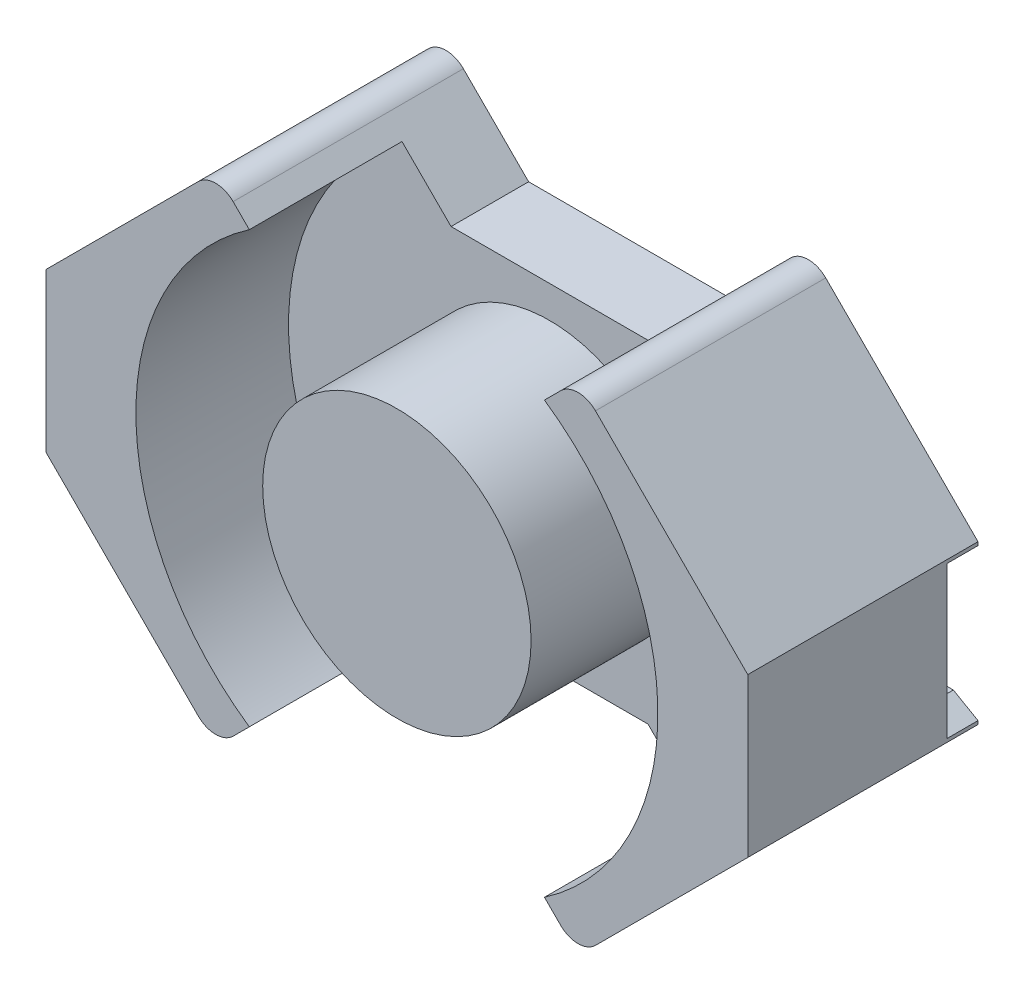
ISO-10303-21;
HEADER;
FILE_DESCRIPTION(('STEP AP214'),'2;1');
FILE_NAME('part.step','',(''),(''),'','','');
FILE_SCHEMA(('AUTOMOTIVE_DESIGN { 1 0 10303 214 1 1 1 1 }'));
ENDSEC;
DATA;
#1=APPLICATION_CONTEXT('core data for automotive mechanical design processes');
#2=APPLICATION_PROTOCOL_DEFINITION('international standard','automotive_design',2000,#1);
#3=PRODUCT_CONTEXT('',#1,'mechanical');
#4=PRODUCT('Part','Part','',(#3));
#5=PRODUCT_RELATED_PRODUCT_CATEGORY('part','',(#4));
#6=PRODUCT_DEFINITION_FORMATION('','',#4);
#7=PRODUCT_DEFINITION_CONTEXT('part definition',#1,'design');
#8=PRODUCT_DEFINITION('design','',#6,#7);
#9=PRODUCT_DEFINITION_SHAPE('','',#8);
#10=(LENGTH_UNIT() NAMED_UNIT(*) SI_UNIT(.MILLI.,.METRE.));
#11=(NAMED_UNIT(*) PLANE_ANGLE_UNIT() SI_UNIT($,.RADIAN.));
#12=(NAMED_UNIT(*) SI_UNIT($,.STERADIAN.) SOLID_ANGLE_UNIT());
#13=UNCERTAINTY_MEASURE_WITH_UNIT(LENGTH_MEASURE(1.E-05),#10,'distance_accuracy_value','');
#14=(GEOMETRIC_REPRESENTATION_CONTEXT(3) GLOBAL_UNCERTAINTY_ASSIGNED_CONTEXT((#13)) GLOBAL_UNIT_ASSIGNED_CONTEXT((#10,
#11,#12)) REPRESENTATION_CONTEXT('',''));
#15=CARTESIAN_POINT('',(0.,0.,0.));
#16=DIRECTION('',(0.,0.,1.));
#17=DIRECTION('',(1.,0.,0.));
#18=AXIS2_PLACEMENT_3D('',#15,#16,#17);
#19=CARTESIAN_POINT('',(0.,0.,9.35));
#20=DIRECTION('',(0.,0.,-1.));
#21=DIRECTION('',(-1.,0.,0.));
#22=AXIS2_PLACEMENT_3D('',#19,#20,#21);
#23=PLANE('',#22);
#24=CARTESIAN_POINT('',(0.,0.,9.35));
#25=DIRECTION('',(0.,0.,-1.));
#26=DIRECTION('',(-1.,0.,0.));
#27=AXIS2_PLACEMENT_3D('',#24,#25,#26);
#28=CIRCLE('',#27,5.45);
#29=CARTESIAN_POINT('',(-5.45,0.,9.35));
#30=VERTEX_POINT('',#29);
#31=EDGE_CURVE('E20',#30,#30,#28,.T.);
#32=ORIENTED_EDGE('',*,*,#31,.F.);
#33=EDGE_LOOP('',(#32));
#34=FACE_BOUND('',#33,.T.);
#35=ADVANCED_FACE('F17',(#34),#23,.F.);
#36=CARTESIAN_POINT('',(0.,0.,9.35));
#37=DIRECTION('',(0.,0.,-1.));
#38=DIRECTION('',(-1.,0.,0.));
#39=AXIS2_PLACEMENT_3D('',#36,#37,#38);
#40=CYLINDRICAL_SURFACE('',#39,5.45);
#41=CARTESIAN_POINT('',(0.,0.,3.15));
#42=DIRECTION('',(0.,0.,-1.));
#43=DIRECTION('',(-1.,0.,0.));
#44=AXIS2_PLACEMENT_3D('',#41,#42,#43);
#45=CIRCLE('',#44,5.45);
#46=CARTESIAN_POINT('',(-5.45,0.,3.15));
#47=VERTEX_POINT('',#46);
#48=EDGE_CURVE('E532',#47,#47,#45,.T.);
#49=ORIENTED_EDGE('',*,*,#48,.F.);
#50=EDGE_LOOP('',(#49));
#51=FACE_BOUND('',#50,.T.);
#52=ORIENTED_EDGE('',*,*,#31,.T.);
#53=EDGE_LOOP('',(#52));
#54=FACE_BOUND('',#53,.T.);
#55=ADVANCED_FACE('F766',(#51,#54),#40,.T.);
#56=CARTESIAN_POINT('',(-7.35776874765386,-8.69355518528076,3.15));
#57=DIRECTION('',(0.,0.,-1.));
#58=DIRECTION('',(-1.,0.,0.));
#59=AXIS2_PLACEMENT_3D('',#56,#57,#58);
#60=CYLINDRICAL_SURFACE('',#59,1.);
#61=CARTESIAN_POINT('',(-7.35776874765386,-8.69355518528076,0.));
#62=DIRECTION('',(0.,0.,-1.));
#63=DIRECTION('',(-1.,0.,0.));
#64=AXIS2_PLACEMENT_3D('',#61,#62,#63);
#65=CIRCLE('',#64,1.);
#66=CARTESIAN_POINT('',(-8.06487552884041,-9.40066196646731,0.));
#67=VERTEX_POINT('',#66);
#68=CARTESIAN_POINT('',(-6.65066196646731,-9.40066196646731,0.));
#69=VERTEX_POINT('',#68);
#70=EDGE_CURVE('E223',#67,#69,#65,.F.);
#71=ORIENTED_EDGE('',*,*,#70,.T.);
#72=DIRECTION('',(0.,0.,1.));
#73=VECTOR('',#72,1.);
#74=CARTESIAN_POINT('',(-6.65066196646731,-9.40066196646731,3.15));
#75=LINE('',#74,#73);
#76=CARTESIAN_POINT('',(-6.65066196646731,-9.40066196646731,9.35));
#77=VERTEX_POINT('',#76);
#78=EDGE_CURVE('E229',#69,#77,#75,.T.);
#79=ORIENTED_EDGE('',*,*,#78,.T.);
#80=CARTESIAN_POINT('',(-7.35776874765386,-8.69355518528076,9.35));
#81=DIRECTION('',(0.,0.,-1.));
#82=DIRECTION('',(-1.,0.,0.));
#83=AXIS2_PLACEMENT_3D('',#80,#81,#82);
#84=CIRCLE('',#83,1.);
#85=CARTESIAN_POINT('',(-8.06487552884041,-9.40066196646731,9.35));
#86=VERTEX_POINT('',#85);
#87=EDGE_CURVE('E526',#86,#77,#84,.F.);
#88=ORIENTED_EDGE('',*,*,#87,.F.);
#89=DIRECTION('',(0.,0.,1.));
#90=VECTOR('',#89,1.);
#91=CARTESIAN_POINT('',(-8.06487552884041,-9.40066196646731,3.15));
#92=LINE('',#91,#90);
#93=EDGE_CURVE('E231',#86,#67,#92,.F.);
#94=ORIENTED_EDGE('',*,*,#93,.T.);
#95=EDGE_LOOP('',(#71,#79,#88,#94));
#96=FACE_BOUND('',#95,.T.);
#97=ADVANCED_FACE('F228',(#96),#60,.T.);
#98=CARTESIAN_POINT('',(7.35776874765386,-8.69355518528077,3.15));
#99=DIRECTION('',(0.,0.,-1.));
#100=DIRECTION('',(-1.,0.,0.));
#101=AXIS2_PLACEMENT_3D('',#98,#99,#100);
#102=CYLINDRICAL_SURFACE('',#101,1.);
#103=CARTESIAN_POINT('',(7.35776874765386,-8.69355518528077,0.));
#104=DIRECTION('',(0.,0.,-1.));
#105=DIRECTION('',(-1.,0.,0.));
#106=AXIS2_PLACEMENT_3D('',#103,#104,#105);
#107=CIRCLE('',#106,1.);
#108=CARTESIAN_POINT('',(6.65066196646731,-9.40066196646731,0.));
#109=VERTEX_POINT('',#108);
#110=CARTESIAN_POINT('',(8.06487552884041,-9.40066196646731,0.));
#111=VERTEX_POINT('',#110);
#112=EDGE_CURVE('E233',#109,#111,#107,.F.);
#113=ORIENTED_EDGE('',*,*,#112,.T.);
#114=DIRECTION('',(0.,0.,1.));
#115=VECTOR('',#114,1.);
#116=CARTESIAN_POINT('',(8.06487552884041,-9.40066196646731,3.15));
#117=LINE('',#116,#115);
#118=CARTESIAN_POINT('',(8.06487552884041,-9.40066196646731,9.35));
#119=VERTEX_POINT('',#118);
#120=EDGE_CURVE('E351',#111,#119,#117,.T.);
#121=ORIENTED_EDGE('',*,*,#120,.T.);
#122=CARTESIAN_POINT('',(7.35776874765386,-8.69355518528077,9.35));
#123=DIRECTION('',(0.,0.,-1.));
#124=DIRECTION('',(-1.,0.,0.));
#125=AXIS2_PLACEMENT_3D('',#122,#123,#124);
#126=CIRCLE('',#125,1.);
#127=CARTESIAN_POINT('',(6.65066196646731,-9.40066196646731,9.35));
#128=VERTEX_POINT('',#127);
#129=EDGE_CURVE('E431',#119,#128,#126,.T.);
#130=ORIENTED_EDGE('',*,*,#129,.T.);
#131=DIRECTION('',(0.,0.,1.));
#132=VECTOR('',#131,1.);
#133=CARTESIAN_POINT('',(6.65066196646731,-9.40066196646731,3.15));
#134=LINE('',#133,#132);
#135=EDGE_CURVE('E358',#128,#109,#134,.F.);
#136=ORIENTED_EDGE('',*,*,#135,.T.);
#137=EDGE_LOOP('',(#113,#121,#130,#136));
#138=FACE_BOUND('',#137,.T.);
#139=ADVANCED_FACE('F544',(#138),#102,.T.);
#140=CARTESIAN_POINT('',(0.,0.,1.25));
#141=DIRECTION('',(0.,0.,-1.));
#142=DIRECTION('',(-1.,0.,0.));
#143=AXIS2_PLACEMENT_3D('',#140,#141,#142);
#144=PLANE('',#143);
#145=DIRECTION('',(1.,0.,0.));
#146=VECTOR('',#145,1.);
#147=CARTESIAN_POINT('',(14.25,2.5,1.25));
#148=LINE('',#147,#146);
#149=CARTESIAN_POINT('',(10.6,2.5,1.25));
#150=VERTEX_POINT('',#149);
#151=CARTESIAN_POINT('',(13.25,2.5,1.25));
#152=VERTEX_POINT('',#151);
#153=EDGE_CURVE('E332',#150,#152,#148,.T.);
#154=ORIENTED_EDGE('',*,*,#153,.T.);
#155=DIRECTION('',(0.866025403784439,0.499999999999999,0.));
#156=VECTOR('',#155,1.);
#157=CARTESIAN_POINT('',(13.25,2.5,1.25));
#158=LINE('',#157,#156);
#159=CARTESIAN_POINT('',(14.25,3.07735026918963,1.25));
#160=VERTEX_POINT('',#159);
#161=EDGE_CURVE('E438',#152,#160,#158,.T.);
#162=ORIENTED_EDGE('',*,*,#161,.T.);
#163=DIRECTION('',(0.,1.,0.));
#164=VECTOR('',#163,1.);
#165=CARTESIAN_POINT('',(14.25,-3.21553749530772,1.25));
#166=LINE('',#165,#164);
#167=CARTESIAN_POINT('',(14.25,-3.07735026918963,1.25));
#168=VERTEX_POINT('',#167);
#169=EDGE_CURVE('E434',#160,#168,#166,.F.);
#170=ORIENTED_EDGE('',*,*,#169,.T.);
#171=DIRECTION('',(0.866025403784439,-0.499999999999999,0.));
#172=VECTOR('',#171,1.);
#173=CARTESIAN_POINT('',(13.25,-2.5,1.25));
#174=LINE('',#173,#172);
#175=CARTESIAN_POINT('',(13.25,-2.5,1.25));
#176=VERTEX_POINT('',#175);
#177=EDGE_CURVE('E348',#168,#176,#174,.F.);
#178=ORIENTED_EDGE('',*,*,#177,.T.);
#179=DIRECTION('',(1.,0.,0.));
#180=VECTOR('',#179,1.);
#181=CARTESIAN_POINT('',(14.25,-2.5,1.25));
#182=LINE('',#181,#180);
#183=CARTESIAN_POINT('',(10.6,-2.5,1.25));
#184=VERTEX_POINT('',#183);
#185=EDGE_CURVE('E342',#176,#184,#182,.F.);
#186=ORIENTED_EDGE('',*,*,#185,.T.);
#187=DIRECTION('',(0.,1.,0.));
#188=VECTOR('',#187,1.);
#189=CARTESIAN_POINT('',(10.6,2.5,1.25));
#190=LINE('',#189,#188);
#191=EDGE_CURVE('E340',#150,#184,#190,.F.);
#192=ORIENTED_EDGE('',*,*,#191,.F.);
#193=EDGE_LOOP('',(#154,#162,#170,#178,#186,#192));
#194=FACE_BOUND('',#193,.T.);
#195=ADVANCED_FACE('F671',(#194),#144,.T.);
#196=CARTESIAN_POINT('',(14.25,-3.21553749530772,3.15));
#197=DIRECTION('',(-1.,0.,0.));
#198=DIRECTION('',(0.,0.,1.));
#199=AXIS2_PLACEMENT_3D('',#196,#197,#198);
#200=PLANE('',#199);
#201=DIRECTION('',(0.,0.,1.));
#202=VECTOR('',#201,1.);
#203=CARTESIAN_POINT('',(14.25,-3.07735026918963,1.25));
#204=LINE('',#203,#202);
#205=CARTESIAN_POINT('',(14.25,-3.07735026918963,0.));
#206=VERTEX_POINT('',#205);
#207=EDGE_CURVE('E350',#206,#168,#204,.T.);
#208=ORIENTED_EDGE('',*,*,#207,.T.);
#209=ORIENTED_EDGE('',*,*,#169,.F.);
#210=DIRECTION('',(0.,0.,1.));
#211=VECTOR('',#210,1.);
#212=CARTESIAN_POINT('',(14.25,3.07735026918963,3.15));
#213=LINE('',#212,#211);
#214=CARTESIAN_POINT('',(14.25,3.07735026918962,0.));
#215=VERTEX_POINT('',#214);
#216=EDGE_CURVE('E331',#160,#215,#213,.F.);
#217=ORIENTED_EDGE('',*,*,#216,.T.);
#218=DIRECTION('',(0.,1.,0.));
#219=VECTOR('',#218,1.);
#220=CARTESIAN_POINT('',(14.25,-3.21553749530772,0.));
#221=LINE('',#220,#219);
#222=CARTESIAN_POINT('',(14.25,3.21553749530772,0.));
#223=VERTEX_POINT('',#222);
#224=EDGE_CURVE('E436',#223,#215,#221,.F.);
#225=ORIENTED_EDGE('',*,*,#224,.F.);
#226=DIRECTION('',(0.,0.,1.));
#227=VECTOR('',#226,1.);
#228=CARTESIAN_POINT('',(14.25,3.21553749530772,3.15));
#229=LINE('',#228,#227);
#230=CARTESIAN_POINT('',(14.25,3.21553749530772,9.35000000000001));
#231=VERTEX_POINT('',#230);
#232=EDGE_CURVE('E323',#223,#231,#229,.T.);
#233=ORIENTED_EDGE('',*,*,#232,.T.);
#234=DIRECTION('',(0.,1.,0.));
#235=VECTOR('',#234,1.);
#236=CARTESIAN_POINT('',(14.25,0.,9.35));
#237=LINE('',#236,#235);
#238=CARTESIAN_POINT('',(14.25,-3.21553749530772,9.35000000000001));
#239=VERTEX_POINT('',#238);
#240=EDGE_CURVE('E427',#231,#239,#237,.F.);
#241=ORIENTED_EDGE('',*,*,#240,.T.);
#242=DIRECTION('',(0.,0.,1.));
#243=VECTOR('',#242,1.);
#244=CARTESIAN_POINT('',(14.25,-3.21553749530772,3.15));
#245=LINE('',#244,#243);
#246=CARTESIAN_POINT('',(14.25,-3.21553749530772,0.));
#247=VERTEX_POINT('',#246);
#248=EDGE_CURVE('E355',#239,#247,#245,.F.);
#249=ORIENTED_EDGE('',*,*,#248,.T.);
#250=DIRECTION('',(0.,1.,0.));
#251=VECTOR('',#250,1.);
#252=CARTESIAN_POINT('',(14.25,-3.21553749530772,0.));
#253=LINE('',#252,#251);
#254=EDGE_CURVE('E428',#206,#247,#253,.F.);
#255=ORIENTED_EDGE('',*,*,#254,.F.);
#256=EDGE_LOOP('',(#208,#209,#217,#225,#233,#241,#249,#255));
#257=FACE_BOUND('',#256,.T.);
#258=ADVANCED_FACE('F649',(#257),#200,.F.);
#259=CARTESIAN_POINT('',(0.,0.,9.35));
#260=DIRECTION('',(0.,0.,-1.));
#261=DIRECTION('',(-1.,0.,0.));
#262=AXIS2_PLACEMENT_3D('',#259,#260,#261);
#263=PLANE('',#262);
#264=ORIENTED_EDGE('',*,*,#129,.F.);
#265=DIRECTION('',(-0.707106781186548,-0.707106781186548,0.));
#266=VECTOR('',#265,1.);
#267=CARTESIAN_POINT('',(7.35776874765386,-10.1077687476539,9.35000000000001));
#268=LINE('',#267,#266);
#269=EDGE_CURVE('E354',#119,#239,#268,.F.);
#270=ORIENTED_EDGE('',*,*,#269,.T.);
#271=ORIENTED_EDGE('',*,*,#240,.F.);
#272=DIRECTION('',(0.707106781186548,-0.707106781186548,0.));
#273=VECTOR('',#272,1.);
#274=CARTESIAN_POINT('',(14.25,3.21553749530772,9.35000000000001));
#275=LINE('',#274,#273);
#276=CARTESIAN_POINT('',(8.06487552884041,9.40066196646731,9.35));
#277=VERTEX_POINT('',#276);
#278=EDGE_CURVE('E322',#231,#277,#275,.F.);
#279=ORIENTED_EDGE('',*,*,#278,.T.);
#280=CARTESIAN_POINT('',(7.35776874765386,8.69355518528077,9.35));
#281=DIRECTION('',(0.,0.,-1.));
#282=DIRECTION('',(-1.,0.,0.));
#283=AXIS2_PLACEMENT_3D('',#280,#281,#282);
#284=CIRCLE('',#283,1.);
#285=CARTESIAN_POINT('',(6.65066196646731,9.40066196646732,9.35));
#286=VERTEX_POINT('',#285);
#287=EDGE_CURVE('E537',#286,#277,#284,.T.);
#288=ORIENTED_EDGE('',*,*,#287,.F.);
#289=DIRECTION('',(0.707106781186549,0.707106781186547,0.));
#290=VECTOR('',#289,1.);
#291=CARTESIAN_POINT('',(5.99313239566174,8.74313239566174,9.35));
#292=LINE('',#291,#290);
#293=CARTESIAN_POINT('',(5.99313239566174,8.74313239566174,9.35));
#294=VERTEX_POINT('',#293);
#295=EDGE_CURVE('E425',#294,#286,#292,.T.);
#296=ORIENTED_EDGE('',*,*,#295,.F.);
#297=CARTESIAN_POINT('',(0.,0.,9.35));
#298=DIRECTION('',(0.,0.,-1.));
#299=DIRECTION('',(-1.,0.,0.));
#300=AXIS2_PLACEMENT_3D('',#297,#298,#299);
#301=CIRCLE('',#300,10.6);
#302=CARTESIAN_POINT('',(5.99313239566174,-8.74313239566174,9.35));
#303=VERTEX_POINT('',#302);
#304=EDGE_CURVE('E539',#294,#303,#301,.T.);
#305=ORIENTED_EDGE('',*,*,#304,.T.);
#306=DIRECTION('',(-0.707106781186548,0.707106781186547,0.));
#307=VECTOR('',#306,1.);
#308=CARTESIAN_POINT('',(4.,-6.75,9.35));
#309=LINE('',#308,#307);
#310=EDGE_CURVE('E363',#303,#128,#309,.F.);
#311=ORIENTED_EDGE('',*,*,#310,.T.);
#312=EDGE_LOOP('',(#264,#270,#271,#279,#288,#296,#305,#311));
#313=FACE_BOUND('',#312,.T.);
#314=ADVANCED_FACE('F679',(#313),#263,.F.);
#315=CARTESIAN_POINT('',(0.,0.,9.35));
#316=DIRECTION('',(0.,0.,-1.));
#317=DIRECTION('',(-1.,0.,0.));
#318=AXIS2_PLACEMENT_3D('',#315,#316,#317);
#319=CYLINDRICAL_SURFACE('',#318,10.6);
#320=DIRECTION('',(0.,0.,1.));
#321=VECTOR('',#320,1.);
#322=CARTESIAN_POINT('',(5.99313239566173,-8.74313239566173,3.15));
#323=LINE('',#322,#321);
#324=CARTESIAN_POINT('',(5.99313239566174,-8.74313239566174,3.15));
#325=VERTEX_POINT('',#324);
#326=EDGE_CURVE('E451',#325,#303,#323,.T.);
#327=ORIENTED_EDGE('',*,*,#326,.T.);
#328=ORIENTED_EDGE('',*,*,#304,.F.);
#329=DIRECTION('',(0.,0.,1.));
#330=VECTOR('',#329,1.);
#331=CARTESIAN_POINT('',(5.99313239566174,8.74313239566174,3.15));
#332=LINE('',#331,#330);
#333=CARTESIAN_POINT('',(5.99313239566174,8.74313239566174,3.15));
#334=VERTEX_POINT('',#333);
#335=EDGE_CURVE('E321',#294,#334,#332,.F.);
#336=ORIENTED_EDGE('',*,*,#335,.T.);
#337=CARTESIAN_POINT('',(0.,0.,3.15));
#338=DIRECTION('',(0.,0.,-1.));
#339=DIRECTION('',(-1.,0.,0.));
#340=AXIS2_PLACEMENT_3D('',#337,#338,#339);
#341=CIRCLE('',#340,10.6);
#342=EDGE_CURVE('E530',#325,#334,#341,.F.);
#343=ORIENTED_EDGE('',*,*,#342,.F.);
#344=EDGE_LOOP('',(#327,#328,#336,#343));
#345=FACE_BOUND('',#344,.T.);
#346=ADVANCED_FACE('F749',(#345),#319,.F.);
#347=CARTESIAN_POINT('',(7.35776874765386,8.69355518528077,3.15));
#348=DIRECTION('',(0.,0.,-1.));
#349=DIRECTION('',(-1.,0.,0.));
#350=AXIS2_PLACEMENT_3D('',#347,#348,#349);
#351=CYLINDRICAL_SURFACE('',#350,1.);
#352=CARTESIAN_POINT('',(7.35776874765386,8.69355518528077,0.));
#353=DIRECTION('',(0.,0.,-1.));
#354=DIRECTION('',(-1.,0.,0.));
#355=AXIS2_PLACEMENT_3D('',#352,#353,#354);
#356=CIRCLE('',#355,1.);
#357=CARTESIAN_POINT('',(8.06487552884041,9.40066196646731,0.));
#358=VERTEX_POINT('',#357);
#359=CARTESIAN_POINT('',(6.65066196646732,9.40066196646731,0.));
#360=VERTEX_POINT('',#359);
#361=EDGE_CURVE('E535',#358,#360,#356,.F.);
#362=ORIENTED_EDGE('',*,*,#361,.T.);
#363=DIRECTION('',(0.,0.,1.));
#364=VECTOR('',#363,1.);
#365=CARTESIAN_POINT('',(6.65066196646732,9.40066196646731,3.15));
#366=LINE('',#365,#364);
#367=EDGE_CURVE('E312',#360,#286,#366,.T.);
#368=ORIENTED_EDGE('',*,*,#367,.T.);
#369=ORIENTED_EDGE('',*,*,#287,.T.);
#370=DIRECTION('',(0.,0.,1.));
#371=VECTOR('',#370,1.);
#372=CARTESIAN_POINT('',(8.06487552884041,9.40066196646731,3.15));
#373=LINE('',#372,#371);
#374=EDGE_CURVE('E318',#277,#358,#373,.F.);
#375=ORIENTED_EDGE('',*,*,#374,.T.);
#376=EDGE_LOOP('',(#362,#368,#369,#375));
#377=FACE_BOUND('',#376,.T.);
#378=ADVANCED_FACE('F640',(#377),#351,.T.);
#379=CARTESIAN_POINT('',(7.35776874765387,10.1077687476539,3.15));
#380=DIRECTION('',(0.,0.,1.));
#381=DIRECTION('',(1.,0.,0.));
#382=AXIS2_PLACEMENT_3D('',#379,#380,#381);
#383=PLANE('',#382);
#384=DIRECTION('',(-0.707106781186548,-0.707106781186548,0.));
#385=VECTOR('',#384,1.);
#386=CARTESIAN_POINT('',(-7.35776874765386,-10.1077687476539,3.15));
#387=LINE('',#386,#385);
#388=CARTESIAN_POINT('',(-5.99313239566174,-8.74313239566174,3.15));
#389=VERTEX_POINT('',#388);
#390=CARTESIAN_POINT('',(-4.,-6.75,3.15));
#391=VERTEX_POINT('',#390);
#392=EDGE_CURVE('E243',#389,#391,#387,.F.);
#393=ORIENTED_EDGE('',*,*,#392,.T.);
#394=DIRECTION('',(1.,0.,0.));
#395=VECTOR('',#394,1.);
#396=CARTESIAN_POINT('',(-4.,-6.75,3.15));
#397=LINE('',#396,#395);
#398=CARTESIAN_POINT('',(4.,-6.75,3.15));
#399=VERTEX_POINT('',#398);
#400=EDGE_CURVE('E368',#391,#399,#397,.T.);
#401=ORIENTED_EDGE('',*,*,#400,.T.);
#402=DIRECTION('',(-0.707106781186548,0.707106781186547,0.));
#403=VECTOR('',#402,1.);
#404=CARTESIAN_POINT('',(4.,-6.75,3.15));
#405=LINE('',#404,#403);
#406=EDGE_CURVE('E367',#399,#325,#405,.F.);
#407=ORIENTED_EDGE('',*,*,#406,.T.);
#408=ORIENTED_EDGE('',*,*,#342,.T.);
#409=DIRECTION('',(0.707106781186548,0.707106781186547,0.));
#410=VECTOR('',#409,1.);
#411=CARTESIAN_POINT('',(4.,6.75,3.15));
#412=LINE('',#411,#410);
#413=CARTESIAN_POINT('',(4.,6.75,3.15));
#414=VERTEX_POINT('',#413);
#415=EDGE_CURVE('E317',#334,#414,#412,.F.);
#416=ORIENTED_EDGE('',*,*,#415,.T.);
#417=DIRECTION('',(1.,0.,0.));
#418=VECTOR('',#417,1.);
#419=CARTESIAN_POINT('',(-4.,6.75,3.15));
#420=LINE('',#419,#418);
#421=CARTESIAN_POINT('',(-4.,6.75,3.15));
#422=VERTEX_POINT('',#421);
#423=EDGE_CURVE('E299',#414,#422,#420,.F.);
#424=ORIENTED_EDGE('',*,*,#423,.T.);
#425=DIRECTION('',(0.707106781186548,-0.707106781186548,0.));
#426=VECTOR('',#425,1.);
#427=CARTESIAN_POINT('',(-7.35776874765386,10.1077687476539,3.15));
#428=LINE('',#427,#426);
#429=CARTESIAN_POINT('',(-5.99313239566174,8.74313239566174,3.15));
#430=VERTEX_POINT('',#429);
#431=EDGE_CURVE('E298',#422,#430,#428,.F.);
#432=ORIENTED_EDGE('',*,*,#431,.T.);
#433=CARTESIAN_POINT('',(0.,0.,3.15));
#434=DIRECTION('',(0.,0.,-1.));
#435=DIRECTION('',(-1.,0.,0.));
#436=AXIS2_PLACEMENT_3D('',#433,#434,#435);
#437=CIRCLE('',#436,10.6);
#438=EDGE_CURVE('E491',#430,#389,#437,.F.);
#439=ORIENTED_EDGE('',*,*,#438,.T.);
#440=EDGE_LOOP('',(#393,#401,#407,#408,#416,#424,#432,#439));
#441=FACE_BOUND('',#440,.T.);
#442=ORIENTED_EDGE('',*,*,#48,.T.);
#443=EDGE_LOOP('',(#442));
#444=FACE_BOUND('',#443,.T.);
#445=ADVANCED_FACE('F742',(#441,#444),#383,.T.);
#446=CARTESIAN_POINT('',(0.,0.,9.35));
#447=DIRECTION('',(0.,0.,-1.));
#448=DIRECTION('',(-1.,0.,0.));
#449=AXIS2_PLACEMENT_3D('',#446,#447,#448);
#450=CYLINDRICAL_SURFACE('',#449,10.6);
#451=CARTESIAN_POINT('',(0.,0.,9.35));
#452=DIRECTION('',(0.,0.,-1.));
#453=DIRECTION('',(-1.,0.,0.));
#454=AXIS2_PLACEMENT_3D('',#451,#452,#453);
#455=CIRCLE('',#454,10.6);
#456=CARTESIAN_POINT('',(-5.99313239566174,-8.74313239566174,9.35));
#457=VERTEX_POINT('',#456);
#458=CARTESIAN_POINT('',(-5.99313239566174,8.74313239566174,9.35));
#459=VERTEX_POINT('',#458);
#460=EDGE_CURVE('E524',#457,#459,#455,.T.);
#461=ORIENTED_EDGE('',*,*,#460,.F.);
#462=DIRECTION('',(0.,0.,1.));
#463=VECTOR('',#462,1.);
#464=CARTESIAN_POINT('',(-5.99313239566174,-8.74313239566174,3.15));
#465=LINE('',#464,#463);
#466=EDGE_CURVE('E378',#457,#389,#465,.F.);
#467=ORIENTED_EDGE('',*,*,#466,.T.);
#468=ORIENTED_EDGE('',*,*,#438,.F.);
#469=DIRECTION('',(0.,0.,1.));
#470=VECTOR('',#469,1.);
#471=CARTESIAN_POINT('',(-5.99313239566174,8.74313239566174,3.15));
#472=LINE('',#471,#470);
#473=EDGE_CURVE('E406',#430,#459,#472,.T.);
#474=ORIENTED_EDGE('',*,*,#473,.T.);
#475=EDGE_LOOP('',(#461,#467,#468,#474));
#476=FACE_BOUND('',#475,.T.);
#477=ADVANCED_FACE('F739',(#476),#450,.F.);
#478=CARTESIAN_POINT('',(-14.25,3.21553749530772,3.15));
#479=DIRECTION('',(1.,0.,0.));
#480=DIRECTION('',(0.,1.,0.));
#481=AXIS2_PLACEMENT_3D('',#478,#479,#480);
#482=PLANE('',#481);
#483=DIRECTION('',(0.,1.,0.));
#484=VECTOR('',#483,1.);
#485=CARTESIAN_POINT('',(-14.25,3.21553749530772,0.));
#486=LINE('',#485,#484);
#487=CARTESIAN_POINT('',(-14.25,-3.21553749530772,0.));
#488=VERTEX_POINT('',#487);
#489=CARTESIAN_POINT('',(-14.25,-3.07735026918963,0.));
#490=VERTEX_POINT('',#489);
#491=EDGE_CURVE('E400',#488,#490,#486,.T.);
#492=ORIENTED_EDGE('',*,*,#491,.F.);
#493=DIRECTION('',(0.,0.,1.));
#494=VECTOR('',#493,1.);
#495=CARTESIAN_POINT('',(-14.25,-3.21553749530772,3.15));
#496=LINE('',#495,#494);
#497=CARTESIAN_POINT('',(-14.25,-3.21553749530772,9.35));
#498=VERTEX_POINT('',#497);
#499=EDGE_CURVE('E380',#488,#498,#496,.T.);
#500=ORIENTED_EDGE('',*,*,#499,.T.);
#501=DIRECTION('',(0.,1.,0.));
#502=VECTOR('',#501,1.);
#503=CARTESIAN_POINT('',(-14.25,0.,9.35));
#504=LINE('',#503,#502);
#505=CARTESIAN_POINT('',(-14.25,3.21553749530772,9.35000000000001));
#506=VERTEX_POINT('',#505);
#507=EDGE_CURVE('E393',#506,#498,#504,.F.);
#508=ORIENTED_EDGE('',*,*,#507,.F.);
#509=DIRECTION('',(0.,0.,1.));
#510=VECTOR('',#509,1.);
#511=CARTESIAN_POINT('',(-14.25,3.21553749530772,3.15));
#512=LINE('',#511,#510);
#513=CARTESIAN_POINT('',(-14.25,3.21553749530772,0.));
#514=VERTEX_POINT('',#513);
#515=EDGE_CURVE('E286',#506,#514,#512,.F.);
#516=ORIENTED_EDGE('',*,*,#515,.T.);
#517=DIRECTION('',(0.,1.,0.));
#518=VECTOR('',#517,1.);
#519=CARTESIAN_POINT('',(-14.25,3.21553749530772,0.));
#520=LINE('',#519,#518);
#521=CARTESIAN_POINT('',(-14.25,3.07735026918963,0.));
#522=VERTEX_POINT('',#521);
#523=EDGE_CURVE('E398',#522,#514,#520,.T.);
#524=ORIENTED_EDGE('',*,*,#523,.F.);
#525=DIRECTION('',(0.,0.,1.));
#526=VECTOR('',#525,1.);
#527=CARTESIAN_POINT('',(-14.25,3.07735026918963,3.15));
#528=LINE('',#527,#526);
#529=CARTESIAN_POINT('',(-14.25,3.07735026918963,1.25));
#530=VERTEX_POINT('',#529);
#531=EDGE_CURVE('E401',#530,#522,#528,.F.);
#532=ORIENTED_EDGE('',*,*,#531,.F.);
#533=DIRECTION('',(0.,1.,0.));
#534=VECTOR('',#533,1.);
#535=CARTESIAN_POINT('',(-14.25,0.,1.25));
#536=LINE('',#535,#534);
#537=CARTESIAN_POINT('',(-14.25,-3.07735026918963,1.25));
#538=VERTEX_POINT('',#537);
#539=EDGE_CURVE('E388',#538,#530,#536,.T.);
#540=ORIENTED_EDGE('',*,*,#539,.F.);
#541=DIRECTION('',(0.,0.,1.));
#542=VECTOR('',#541,1.);
#543=CARTESIAN_POINT('',(-14.25,-3.07735026918963,3.15));
#544=LINE('',#543,#542);
#545=EDGE_CURVE('E473',#490,#538,#544,.T.);
#546=ORIENTED_EDGE('',*,*,#545,.F.);
#547=EDGE_LOOP('',(#492,#500,#508,#516,#524,#532,#540,#546));
#548=FACE_BOUND('',#547,.T.);
#549=ADVANCED_FACE('F603',(#548),#482,.F.);
#550=CARTESIAN_POINT('',(-7.35776874765386,8.69355518528076,3.15));
#551=DIRECTION('',(0.,0.,-1.));
#552=DIRECTION('',(-1.,0.,0.));
#553=AXIS2_PLACEMENT_3D('',#550,#551,#552);
#554=CYLINDRICAL_SURFACE('',#553,1.);
#555=CARTESIAN_POINT('',(-7.35776874765386,8.69355518528076,0.));
#556=DIRECTION('',(0.,0.,-1.));
#557=DIRECTION('',(-1.,0.,0.));
#558=AXIS2_PLACEMENT_3D('',#555,#556,#557);
#559=CIRCLE('',#558,1.);
#560=CARTESIAN_POINT('',(-6.65066196646731,9.40066196646731,0.));
#561=VERTEX_POINT('',#560);
#562=CARTESIAN_POINT('',(-8.06487552884041,9.40066196646731,0.));
#563=VERTEX_POINT('',#562);
#564=EDGE_CURVE('E477',#561,#563,#559,.F.);
#565=ORIENTED_EDGE('',*,*,#564,.T.);
#566=DIRECTION('',(0.,0.,1.));
#567=VECTOR('',#566,1.);
#568=CARTESIAN_POINT('',(-8.06487552884041,9.40066196646731,3.15));
#569=LINE('',#568,#567);
#570=CARTESIAN_POINT('',(-8.06487552884041,9.40066196646731,9.35));
#571=VERTEX_POINT('',#570);
#572=EDGE_CURVE('E282',#563,#571,#569,.T.);
#573=ORIENTED_EDGE('',*,*,#572,.T.);
#574=CARTESIAN_POINT('',(-7.35776874765386,8.69355518528076,9.35));
#575=DIRECTION('',(0.,0.,-1.));
#576=DIRECTION('',(-1.,0.,0.));
#577=AXIS2_PLACEMENT_3D('',#574,#575,#576);
#578=CIRCLE('',#577,1.);
#579=CARTESIAN_POINT('',(-6.65066196646731,9.40066196646731,9.35));
#580=VERTEX_POINT('',#579);
#581=EDGE_CURVE('E395',#580,#571,#578,.F.);
#582=ORIENTED_EDGE('',*,*,#581,.F.);
#583=DIRECTION('',(0.,0.,1.));
#584=VECTOR('',#583,1.);
#585=CARTESIAN_POINT('',(-6.65066196646731,9.40066196646731,3.15));
#586=LINE('',#585,#584);
#587=EDGE_CURVE('E289',#580,#561,#586,.F.);
#588=ORIENTED_EDGE('',*,*,#587,.T.);
#589=EDGE_LOOP('',(#565,#573,#582,#588));
#590=FACE_BOUND('',#589,.T.);
#591=ADVANCED_FACE('F623',(#590),#554,.T.);
#592=CARTESIAN_POINT('',(0.,0.,9.35));
#593=DIRECTION('',(0.,0.,1.));
#594=DIRECTION('',(1.,0.,0.));
#595=AXIS2_PLACEMENT_3D('',#592,#593,#594);
#596=PLANE('',#595);
#597=DIRECTION('',(0.707106781186548,0.707106781186548,0.));
#598=VECTOR('',#597,1.);
#599=CARTESIAN_POINT('',(-7.35776874765386,10.1077687476539,9.35000000000001));
#600=LINE('',#599,#598);
#601=EDGE_CURVE('E285',#571,#506,#600,.F.);
#602=ORIENTED_EDGE('',*,*,#601,.T.);
#603=ORIENTED_EDGE('',*,*,#507,.T.);
#604=DIRECTION('',(-0.707106781186547,0.707106781186548,0.));
#605=VECTOR('',#604,1.);
#606=CARTESIAN_POINT('',(-14.25,-3.21553749530772,9.35));
#607=LINE('',#606,#605);
#608=EDGE_CURVE('E379',#498,#86,#607,.F.);
#609=ORIENTED_EDGE('',*,*,#608,.T.);
#610=ORIENTED_EDGE('',*,*,#87,.T.);
#611=DIRECTION('',(-0.707106781186548,-0.707106781186548,0.));
#612=VECTOR('',#611,1.);
#613=CARTESIAN_POINT('',(-7.35776874765386,-10.1077687476539,9.35000000000001));
#614=LINE('',#613,#612);
#615=EDGE_CURVE('E242',#77,#457,#614,.F.);
#616=ORIENTED_EDGE('',*,*,#615,.T.);
#617=ORIENTED_EDGE('',*,*,#460,.T.);
#618=DIRECTION('',(0.707106781186548,-0.707106781186548,0.));
#619=VECTOR('',#618,1.);
#620=CARTESIAN_POINT('',(-7.35776874765386,10.1077687476539,9.35000000000001));
#621=LINE('',#620,#619);
#622=EDGE_CURVE('E294',#459,#580,#621,.F.);
#623=ORIENTED_EDGE('',*,*,#622,.T.);
#624=ORIENTED_EDGE('',*,*,#581,.T.);
#625=EDGE_LOOP('',(#602,#603,#609,#610,#616,#617,#623,#624));
#626=FACE_BOUND('',#625,.T.);
#627=ADVANCED_FACE('F613',(#626),#596,.T.);
#628=CARTESIAN_POINT('',(0.,0.,1.25));
#629=DIRECTION('',(0.,0.,-1.));
#630=DIRECTION('',(-1.,0.,0.));
#631=AXIS2_PLACEMENT_3D('',#628,#629,#630);
#632=PLANE('',#631);
#633=DIRECTION('',(1.,0.,0.));
#634=VECTOR('',#633,1.);
#635=CARTESIAN_POINT('',(-14.25,-2.5,1.25));
#636=LINE('',#635,#634);
#637=CARTESIAN_POINT('',(-10.6,-2.5,1.25));
#638=VERTEX_POINT('',#637);
#639=CARTESIAN_POINT('',(-13.25,-2.5,1.25));
#640=VERTEX_POINT('',#639);
#641=EDGE_CURVE('E265',#638,#640,#636,.F.);
#642=ORIENTED_EDGE('',*,*,#641,.T.);
#643=DIRECTION('',(-0.866025403784439,-0.499999999999999,0.));
#644=VECTOR('',#643,1.);
#645=CARTESIAN_POINT('',(-13.25,-2.5,1.25));
#646=LINE('',#645,#644);
#647=EDGE_CURVE('E383',#640,#538,#646,.T.);
#648=ORIENTED_EDGE('',*,*,#647,.T.);
#649=ORIENTED_EDGE('',*,*,#539,.T.);
#650=DIRECTION('',(-0.866025403784439,0.499999999999999,0.));
#651=VECTOR('',#650,1.);
#652=CARTESIAN_POINT('',(-14.25,3.07735026918963,1.25));
#653=LINE('',#652,#651);
#654=CARTESIAN_POINT('',(-13.25,2.5,1.25));
#655=VERTEX_POINT('',#654);
#656=EDGE_CURVE('E281',#530,#655,#653,.F.);
#657=ORIENTED_EDGE('',*,*,#656,.T.);
#658=DIRECTION('',(1.,0.,0.));
#659=VECTOR('',#658,1.);
#660=CARTESIAN_POINT('',(-14.25,2.5,1.25));
#661=LINE('',#660,#659);
#662=CARTESIAN_POINT('',(-10.6,2.5,1.25));
#663=VERTEX_POINT('',#662);
#664=EDGE_CURVE('E275',#655,#663,#661,.T.);
#665=ORIENTED_EDGE('',*,*,#664,.T.);
#666=DIRECTION('',(0.,1.,0.));
#667=VECTOR('',#666,1.);
#668=CARTESIAN_POINT('',(-10.6,2.5,1.25));
#669=LINE('',#668,#667);
#670=EDGE_CURVE('E273',#638,#663,#669,.T.);
#671=ORIENTED_EDGE('',*,*,#670,.F.);
#672=EDGE_LOOP('',(#642,#648,#649,#657,#665,#671));
#673=FACE_BOUND('',#672,.T.);
#674=ADVANCED_FACE('F605',(#673),#632,.T.);
#675=CARTESIAN_POINT('',(-14.25,-3.21553749530772,3.15));
#676=DIRECTION('',(0.707106781186548,0.707106781186547,0.));
#677=DIRECTION('',(-0.707106781186547,0.707106781186548,0.));
#678=AXIS2_PLACEMENT_3D('',#675,#676,#677);
#679=PLANE('',#678);
#680=ORIENTED_EDGE('',*,*,#93,.F.);
#681=ORIENTED_EDGE('',*,*,#608,.F.);
#682=ORIENTED_EDGE('',*,*,#499,.F.);
#683=DIRECTION('',(0.707106781186547,-0.707106781186548,0.));
#684=VECTOR('',#683,1.);
#685=CARTESIAN_POINT('',(-14.25,-3.21553749530772,0.));
#686=LINE('',#685,#684);
#687=EDGE_CURVE('E251',#488,#67,#686,.T.);
#688=ORIENTED_EDGE('',*,*,#687,.T.);
#689=EDGE_LOOP('',(#680,#681,#682,#688));
#690=FACE_BOUND('',#689,.T.);
#691=ADVANCED_FACE('F611',(#690),#679,.F.);
#692=CARTESIAN_POINT('',(-7.35776874765386,-10.1077687476539,3.15));
#693=DIRECTION('',(-0.707106781186548,0.707106781186548,0.));
#694=DIRECTION('',(-0.707106781186548,-0.707106781186548,0.));
#695=AXIS2_PLACEMENT_3D('',#692,#693,#694);
#696=PLANE('',#695);
#697=ORIENTED_EDGE('',*,*,#78,.F.);
#698=DIRECTION('',(0.707106781186547,0.707106781186548,0.));
#699=VECTOR('',#698,1.);
#700=CARTESIAN_POINT('',(-6.65066196646731,-9.40066196646731,0.));
#701=LINE('',#700,#699);
#702=CARTESIAN_POINT('',(-4.,-6.75,0.));
#703=VERTEX_POINT('',#702);
#704=EDGE_CURVE('E239',#69,#703,#701,.T.);
#705=ORIENTED_EDGE('',*,*,#704,.T.);
#706=DIRECTION('',(0.,0.,1.));
#707=VECTOR('',#706,1.);
#708=CARTESIAN_POINT('',(-4.,-6.75,3.15));
#709=LINE('',#708,#707);
#710=EDGE_CURVE('E373',#703,#391,#709,.T.);
#711=ORIENTED_EDGE('',*,*,#710,.T.);
#712=ORIENTED_EDGE('',*,*,#392,.F.);
#713=ORIENTED_EDGE('',*,*,#466,.F.);
#714=ORIENTED_EDGE('',*,*,#615,.F.);
#715=EDGE_LOOP('',(#697,#705,#711,#712,#713,#714));
#716=FACE_BOUND('',#715,.T.);
#717=ADVANCED_FACE('F237',(#716),#696,.F.);
#718=CARTESIAN_POINT('',(-4.,-6.75,3.15));
#719=DIRECTION('',(0.,1.,0.));
#720=DIRECTION('',(0.,0.,1.));
#721=AXIS2_PLACEMENT_3D('',#718,#719,#720);
#722=PLANE('',#721);
#723=DIRECTION('',(0.,0.,1.));
#724=VECTOR('',#723,1.);
#725=CARTESIAN_POINT('',(4.,-6.75,3.15));
#726=LINE('',#725,#724);
#727=CARTESIAN_POINT('',(4.,-6.75,0.));
#728=VERTEX_POINT('',#727);
#729=EDGE_CURVE('E364',#728,#399,#726,.T.);
#730=ORIENTED_EDGE('',*,*,#729,.T.);
#731=ORIENTED_EDGE('',*,*,#400,.F.);
#732=ORIENTED_EDGE('',*,*,#710,.F.);
#733=DIRECTION('',(1.,0.,0.));
#734=VECTOR('',#733,1.);
#735=CARTESIAN_POINT('',(7.35776874765387,-6.75,0.));
#736=LINE('',#735,#734);
#737=EDGE_CURVE('E250',#703,#728,#736,.T.);
#738=ORIENTED_EDGE('',*,*,#737,.T.);
#739=EDGE_LOOP('',(#730,#731,#732,#738));
#740=FACE_BOUND('',#739,.T.);
#741=ADVANCED_FACE('F722',(#740),#722,.F.);
#742=CARTESIAN_POINT('',(4.,-6.75,3.15));
#743=DIRECTION('',(0.707106781186547,0.707106781186548,0.));
#744=DIRECTION('',(-0.707106781186548,0.707106781186547,0.));
#745=AXIS2_PLACEMENT_3D('',#742,#743,#744);
#746=PLANE('',#745);
#747=ORIENTED_EDGE('',*,*,#135,.F.);
#748=ORIENTED_EDGE('',*,*,#310,.F.);
#749=ORIENTED_EDGE('',*,*,#326,.F.);
#750=ORIENTED_EDGE('',*,*,#406,.F.);
#751=ORIENTED_EDGE('',*,*,#729,.F.);
#752=DIRECTION('',(0.707106781186548,-0.707106781186548,0.));
#753=VECTOR('',#752,1.);
#754=CARTESIAN_POINT('',(4.,-6.75,0.));
#755=LINE('',#754,#753);
#756=EDGE_CURVE('E253',#728,#109,#755,.T.);
#757=ORIENTED_EDGE('',*,*,#756,.T.);
#758=EDGE_LOOP('',(#747,#748,#749,#750,#751,#757));
#759=FACE_BOUND('',#758,.T.);
#760=ADVANCED_FACE('F719',(#759),#746,.F.);
#761=CARTESIAN_POINT('',(7.35776874765386,-10.1077687476539,3.15));
#762=DIRECTION('',(-0.707106781186548,0.707106781186548,0.));
#763=DIRECTION('',(-0.707106781186548,-0.707106781186548,0.));
#764=AXIS2_PLACEMENT_3D('',#761,#762,#763);
#765=PLANE('',#764);
#766=ORIENTED_EDGE('',*,*,#120,.F.);
#767=DIRECTION('',(0.707106781186547,0.707106781186548,0.));
#768=VECTOR('',#767,1.);
#769=CARTESIAN_POINT('',(8.06487552884041,-9.40066196646732,0.));
#770=LINE('',#769,#768);
#771=EDGE_CURVE('E509',#111,#247,#770,.T.);
#772=ORIENTED_EDGE('',*,*,#771,.T.);
#773=ORIENTED_EDGE('',*,*,#248,.F.);
#774=ORIENTED_EDGE('',*,*,#269,.F.);
#775=EDGE_LOOP('',(#766,#772,#773,#774));
#776=FACE_BOUND('',#775,.T.);
#777=ADVANCED_FACE('F551',(#776),#765,.F.);
#778=CARTESIAN_POINT('',(13.25,-2.5,1.25));
#779=DIRECTION('',(-0.499999999999999,-0.866025403784439,0.));
#780=DIRECTION('',(0.866025403784439,-0.499999999999999,0.));
#781=AXIS2_PLACEMENT_3D('',#778,#779,#780);
#782=PLANE('',#781);
#783=ORIENTED_EDGE('',*,*,#207,.F.);
#784=DIRECTION('',(-0.866025403784439,0.499999999999999,0.));
#785=VECTOR('',#784,1.);
#786=CARTESIAN_POINT('',(14.25,-3.07735026918963,0.));
#787=LINE('',#786,#785);
#788=CARTESIAN_POINT('',(13.25,-2.5,0.));
#789=VERTEX_POINT('',#788);
#790=EDGE_CURVE('E505',#206,#789,#787,.T.);
#791=ORIENTED_EDGE('',*,*,#790,.T.);
#792=DIRECTION('',(0.,0.,-1.));
#793=VECTOR('',#792,1.);
#794=CARTESIAN_POINT('',(13.25,-2.5,1.25));
#795=LINE('',#794,#793);
#796=EDGE_CURVE('E345',#789,#176,#795,.F.);
#797=ORIENTED_EDGE('',*,*,#796,.T.);
#798=ORIENTED_EDGE('',*,*,#177,.F.);
#799=EDGE_LOOP('',(#783,#791,#797,#798));
#800=FACE_BOUND('',#799,.T.);
#801=ADVANCED_FACE('F669',(#800),#782,.F.);
#802=CARTESIAN_POINT('',(14.25,-2.5,1.25));
#803=DIRECTION('',(0.,-1.,0.));
#804=DIRECTION('',(0.,0.,-1.));
#805=AXIS2_PLACEMENT_3D('',#802,#803,#804);
#806=PLANE('',#805);
#807=ORIENTED_EDGE('',*,*,#796,.F.);
#808=DIRECTION('',(1.,0.,0.));
#809=VECTOR('',#808,1.);
#810=CARTESIAN_POINT('',(7.35776874765387,-2.5,0.));
#811=LINE('',#810,#809);
#812=CARTESIAN_POINT('',(10.3795912741144,-2.5,0.));
#813=VERTEX_POINT('',#812);
#814=EDGE_CURVE('E508',#789,#813,#811,.F.);
#815=ORIENTED_EDGE('',*,*,#814,.T.);
#816=DIRECTION('',(-0.173648177666931,0.,-0.984807753012208));
#817=VECTOR('',#816,1.);
#818=CARTESIAN_POINT('',(10.6,-2.5,1.25));
#819=LINE('',#818,#817);
#820=EDGE_CURVE('E338',#184,#813,#819,.T.);
#821=ORIENTED_EDGE('',*,*,#820,.F.);
#822=ORIENTED_EDGE('',*,*,#185,.F.);
#823=EDGE_LOOP('',(#807,#815,#821,#822));
#824=FACE_BOUND('',#823,.T.);
#825=ADVANCED_FACE('F664',(#824),#806,.F.);
#826=CARTESIAN_POINT('',(10.6,2.5,1.25));
#827=DIRECTION('',(0.984807753012208,0.,-0.173648177666931));
#828=DIRECTION('',(-0.173648177666931,0.,-0.984807753012208));
#829=AXIS2_PLACEMENT_3D('',#826,#827,#828);
#830=PLANE('',#829);
#831=ORIENTED_EDGE('',*,*,#191,.T.);
#832=ORIENTED_EDGE('',*,*,#820,.T.);
#833=DIRECTION('',(0.,1.,0.));
#834=VECTOR('',#833,1.);
#835=CARTESIAN_POINT('',(10.3795912741144,10.1077687476539,0.));
#836=LINE('',#835,#834);
#837=CARTESIAN_POINT('',(10.3795912741144,2.5,0.));
#838=VERTEX_POINT('',#837);
#839=EDGE_CURVE('E559',#813,#838,#836,.T.);
#840=ORIENTED_EDGE('',*,*,#839,.T.);
#841=DIRECTION('',(0.17364817766693,0.,0.984807753012208));
#842=VECTOR('',#841,1.);
#843=CARTESIAN_POINT('',(10.3795912741144,2.5,0.));
#844=LINE('',#843,#842);
#845=EDGE_CURVE('E335',#838,#150,#844,.T.);
#846=ORIENTED_EDGE('',*,*,#845,.T.);
#847=EDGE_LOOP('',(#831,#832,#840,#846));
#848=FACE_BOUND('',#847,.T.);
#849=ADVANCED_FACE('F660',(#848),#830,.T.);
#850=CARTESIAN_POINT('',(14.25,2.5,1.25));
#851=DIRECTION('',(0.,1.,0.));
#852=DIRECTION('',(0.,0.,1.));
#853=AXIS2_PLACEMENT_3D('',#850,#851,#852);
#854=PLANE('',#853);
#855=DIRECTION('',(0.,0.,1.));
#856=VECTOR('',#855,1.);
#857=CARTESIAN_POINT('',(13.25,2.5,3.15));
#858=LINE('',#857,#856);
#859=CARTESIAN_POINT('',(13.25,2.5,0.));
#860=VERTEX_POINT('',#859);
#861=EDGE_CURVE('E326',#860,#152,#858,.T.);
#862=ORIENTED_EDGE('',*,*,#861,.T.);
#863=ORIENTED_EDGE('',*,*,#153,.F.);
#864=ORIENTED_EDGE('',*,*,#845,.F.);
#865=DIRECTION('',(1.,0.,0.));
#866=VECTOR('',#865,1.);
#867=CARTESIAN_POINT('',(7.35776874765387,2.5,0.));
#868=LINE('',#867,#866);
#869=EDGE_CURVE('E520',#838,#860,#868,.T.);
#870=ORIENTED_EDGE('',*,*,#869,.T.);
#871=EDGE_LOOP('',(#862,#863,#864,#870));
#872=FACE_BOUND('',#871,.T.);
#873=ADVANCED_FACE('F657',(#872),#854,.F.);
#874=CARTESIAN_POINT('',(14.25,3.07735026918963,3.15));
#875=DIRECTION('',(-0.499999999999999,0.866025403784439,0.));
#876=DIRECTION('',(-0.866025403784439,-0.499999999999999,0.));
#877=AXIS2_PLACEMENT_3D('',#874,#875,#876);
#878=PLANE('',#877);
#879=ORIENTED_EDGE('',*,*,#861,.F.);
#880=DIRECTION('',(0.86602540378444,0.499999999999998,0.));
#881=VECTOR('',#880,1.);
#882=CARTESIAN_POINT('',(13.25,2.5,0.));
#883=LINE('',#882,#881);
#884=EDGE_CURVE('E516',#860,#215,#883,.T.);
#885=ORIENTED_EDGE('',*,*,#884,.T.);
#886=ORIENTED_EDGE('',*,*,#216,.F.);
#887=ORIENTED_EDGE('',*,*,#161,.F.);
#888=EDGE_LOOP('',(#879,#885,#886,#887));
#889=FACE_BOUND('',#888,.T.);
#890=ADVANCED_FACE('F653',(#889),#878,.F.);
#891=CARTESIAN_POINT('',(14.25,3.21553749530772,3.15));
#892=DIRECTION('',(-0.707106781186548,-0.707106781186548,0.));
#893=DIRECTION('',(0.707106781186548,-0.707106781186548,0.));
#894=AXIS2_PLACEMENT_3D('',#891,#892,#893);
#895=PLANE('',#894);
#896=ORIENTED_EDGE('',*,*,#374,.F.);
#897=ORIENTED_EDGE('',*,*,#278,.F.);
#898=ORIENTED_EDGE('',*,*,#232,.F.);
#899=DIRECTION('',(-0.707106781186547,0.707106781186547,0.));
#900=VECTOR('',#899,1.);
#901=CARTESIAN_POINT('',(14.25,3.21553749530772,0.));
#902=LINE('',#901,#900);
#903=EDGE_CURVE('E519',#223,#358,#902,.T.);
#904=ORIENTED_EDGE('',*,*,#903,.T.);
#905=EDGE_LOOP('',(#896,#897,#898,#904));
#906=FACE_BOUND('',#905,.T.);
#907=ADVANCED_FACE('F646',(#906),#895,.F.);
#908=CARTESIAN_POINT('',(4.,6.75,3.15));
#909=DIRECTION('',(0.707106781186547,-0.707106781186548,0.));
#910=DIRECTION('',(0.707106781186548,0.707106781186547,0.));
#911=AXIS2_PLACEMENT_3D('',#908,#909,#910);
#912=PLANE('',#911);
#913=ORIENTED_EDGE('',*,*,#367,.F.);
#914=DIRECTION('',(-0.707106781186548,-0.707106781186547,0.));
#915=VECTOR('',#914,1.);
#916=CARTESIAN_POINT('',(6.65066196646732,9.40066196646731,0.));
#917=LINE('',#916,#915);
#918=CARTESIAN_POINT('',(4.,6.75,0.));
#919=VERTEX_POINT('',#918);
#920=EDGE_CURVE('E306',#360,#919,#917,.T.);
#921=ORIENTED_EDGE('',*,*,#920,.T.);
#922=DIRECTION('',(0.,0.,-1.));
#923=VECTOR('',#922,1.);
#924=CARTESIAN_POINT('',(4.,6.75,3.15));
#925=LINE('',#924,#923);
#926=EDGE_CURVE('E309',#919,#414,#925,.F.);
#927=ORIENTED_EDGE('',*,*,#926,.T.);
#928=ORIENTED_EDGE('',*,*,#415,.F.);
#929=ORIENTED_EDGE('',*,*,#335,.F.);
#930=ORIENTED_EDGE('',*,*,#295,.T.);
#931=EDGE_LOOP('',(#913,#921,#927,#928,#929,#930));
#932=FACE_BOUND('',#931,.T.);
#933=ADVANCED_FACE('F635',(#932),#912,.F.);
#934=CARTESIAN_POINT('',(-4.,6.75,3.15));
#935=DIRECTION('',(0.,-1.,0.));
#936=DIRECTION('',(0.,0.,-1.));
#937=AXIS2_PLACEMENT_3D('',#934,#935,#936);
#938=PLANE('',#937);
#939=DIRECTION('',(0.,0.,1.));
#940=VECTOR('',#939,1.);
#941=CARTESIAN_POINT('',(-4.,6.75,3.15));
#942=LINE('',#941,#940);
#943=CARTESIAN_POINT('',(-4.,6.75,0.));
#944=VERTEX_POINT('',#943);
#945=EDGE_CURVE('E295',#944,#422,#942,.T.);
#946=ORIENTED_EDGE('',*,*,#945,.T.);
#947=ORIENTED_EDGE('',*,*,#423,.F.);
#948=ORIENTED_EDGE('',*,*,#926,.F.);
#949=DIRECTION('',(1.,0.,0.));
#950=VECTOR('',#949,1.);
#951=CARTESIAN_POINT('',(7.35776874765387,6.75,0.));
#952=LINE('',#951,#950);
#953=EDGE_CURVE('E302',#919,#944,#952,.F.);
#954=ORIENTED_EDGE('',*,*,#953,.T.);
#955=EDGE_LOOP('',(#946,#947,#948,#954));
#956=FACE_BOUND('',#955,.T.);
#957=ADVANCED_FACE('F631',(#956),#938,.F.);
#958=CARTESIAN_POINT('',(-7.35776874765386,10.1077687476539,3.15));
#959=DIRECTION('',(-0.707106781186548,-0.707106781186548,0.));
#960=DIRECTION('',(0.707106781186548,-0.707106781186548,0.));
#961=AXIS2_PLACEMENT_3D('',#958,#959,#960);
#962=PLANE('',#961);
#963=ORIENTED_EDGE('',*,*,#587,.F.);
#964=ORIENTED_EDGE('',*,*,#622,.F.);
#965=ORIENTED_EDGE('',*,*,#473,.F.);
#966=ORIENTED_EDGE('',*,*,#431,.F.);
#967=ORIENTED_EDGE('',*,*,#945,.F.);
#968=DIRECTION('',(-0.707106781186547,0.707106781186548,0.));
#969=VECTOR('',#968,1.);
#970=CARTESIAN_POINT('',(-4.,6.75,0.));
#971=LINE('',#970,#969);
#972=EDGE_CURVE('E305',#944,#561,#971,.T.);
#973=ORIENTED_EDGE('',*,*,#972,.T.);
#974=EDGE_LOOP('',(#963,#964,#965,#966,#967,#973));
#975=FACE_BOUND('',#974,.T.);
#976=ADVANCED_FACE('F626',(#975),#962,.F.);
#977=CARTESIAN_POINT('',(-7.35776874765386,10.1077687476539,3.15));
#978=DIRECTION('',(0.707106781186548,-0.707106781186548,0.));
#979=DIRECTION('',(0.707106781186548,0.707106781186548,0.));
#980=AXIS2_PLACEMENT_3D('',#977,#978,#979);
#981=PLANE('',#980);
#982=ORIENTED_EDGE('',*,*,#572,.F.);
#983=DIRECTION('',(-0.707106781186547,-0.707106781186547,0.));
#984=VECTOR('',#983,1.);
#985=CARTESIAN_POINT('',(-8.06487552884041,9.40066196646731,0.));
#986=LINE('',#985,#984);
#987=EDGE_CURVE('E486',#563,#514,#986,.T.);
#988=ORIENTED_EDGE('',*,*,#987,.T.);
#989=ORIENTED_EDGE('',*,*,#515,.F.);
#990=ORIENTED_EDGE('',*,*,#601,.F.);
#991=EDGE_LOOP('',(#982,#988,#989,#990));
#992=FACE_BOUND('',#991,.T.);
#993=ADVANCED_FACE('F618',(#992),#981,.F.);
#994=CARTESIAN_POINT('',(-14.25,3.07735026918963,3.15));
#995=DIRECTION('',(0.499999999999999,0.866025403784439,0.));
#996=DIRECTION('',(-0.866025403784439,0.499999999999999,0.));
#997=AXIS2_PLACEMENT_3D('',#994,#995,#996);
#998=PLANE('',#997);
#999=ORIENTED_EDGE('',*,*,#531,.T.);
#1000=DIRECTION('',(0.86602540378444,-0.499999999999998,0.));
#1001=VECTOR('',#1000,1.);
#1002=CARTESIAN_POINT('',(-14.25,3.07735026918963,0.));
#1003=LINE('',#1002,#1001);
#1004=CARTESIAN_POINT('',(-13.25,2.5,0.));
#1005=VERTEX_POINT('',#1004);
#1006=EDGE_CURVE('E482',#522,#1005,#1003,.T.);
#1007=ORIENTED_EDGE('',*,*,#1006,.T.);
#1008=DIRECTION('',(0.,0.,1.));
#1009=VECTOR('',#1008,1.);
#1010=CARTESIAN_POINT('',(-13.25,2.5,1.25));
#1011=LINE('',#1010,#1009);
#1012=EDGE_CURVE('E278',#1005,#655,#1011,.T.);
#1013=ORIENTED_EDGE('',*,*,#1012,.T.);
#1014=ORIENTED_EDGE('',*,*,#656,.F.);
#1015=EDGE_LOOP('',(#999,#1007,#1013,#1014));
#1016=FACE_BOUND('',#1015,.T.);
#1017=ADVANCED_FACE('F599',(#1016),#998,.F.);
#1018=CARTESIAN_POINT('',(-14.25,2.5,1.25));
#1019=DIRECTION('',(0.,1.,0.));
#1020=DIRECTION('',(0.,0.,1.));
#1021=AXIS2_PLACEMENT_3D('',#1018,#1019,#1020);
#1022=PLANE('',#1021);
#1023=DIRECTION('',(-0.173648177666931,0.,0.984807753012208));
#1024=VECTOR('',#1023,1.);
#1025=CARTESIAN_POINT('',(-10.6,2.5,1.25));
#1026=LINE('',#1025,#1024);
#1027=CARTESIAN_POINT('',(-10.3795912741144,2.5,0.));
#1028=VERTEX_POINT('',#1027);
#1029=EDGE_CURVE('E271',#663,#1028,#1026,.F.);
#1030=ORIENTED_EDGE('',*,*,#1029,.F.);
#1031=ORIENTED_EDGE('',*,*,#664,.F.);
#1032=ORIENTED_EDGE('',*,*,#1012,.F.);
#1033=DIRECTION('',(1.,0.,0.));
#1034=VECTOR('',#1033,1.);
#1035=CARTESIAN_POINT('',(7.35776874765387,2.5,0.));
#1036=LINE('',#1035,#1034);
#1037=EDGE_CURVE('E485',#1005,#1028,#1036,.T.);
#1038=ORIENTED_EDGE('',*,*,#1037,.T.);
#1039=EDGE_LOOP('',(#1030,#1031,#1032,#1038));
#1040=FACE_BOUND('',#1039,.T.);
#1041=ADVANCED_FACE('F596',(#1040),#1022,.F.);
#1042=CARTESIAN_POINT('',(-10.6,2.5,1.25));
#1043=DIRECTION('',(-0.984807753012208,0.,-0.173648177666931));
#1044=DIRECTION('',(-0.173648177666931,0.,0.984807753012208));
#1045=AXIS2_PLACEMENT_3D('',#1042,#1043,#1044);
#1046=PLANE('',#1045);
#1047=ORIENTED_EDGE('',*,*,#670,.T.);
#1048=ORIENTED_EDGE('',*,*,#1029,.T.);
#1049=DIRECTION('',(0.,1.,0.));
#1050=VECTOR('',#1049,1.);
#1051=CARTESIAN_POINT('',(-10.3795912741144,10.1077687476539,0.));
#1052=LINE('',#1051,#1050);
#1053=CARTESIAN_POINT('',(-10.3795912741144,-2.5,0.));
#1054=VERTEX_POINT('',#1053);
#1055=EDGE_CURVE('E582',#1028,#1054,#1052,.F.);
#1056=ORIENTED_EDGE('',*,*,#1055,.T.);
#1057=DIRECTION('',(-0.17364817766693,0.,0.984807753012208));
#1058=VECTOR('',#1057,1.);
#1059=CARTESIAN_POINT('',(-10.3795912741144,-2.5,0.));
#1060=LINE('',#1059,#1058);
#1061=EDGE_CURVE('E268',#1054,#638,#1060,.T.);
#1062=ORIENTED_EDGE('',*,*,#1061,.T.);
#1063=EDGE_LOOP('',(#1047,#1048,#1056,#1062));
#1064=FACE_BOUND('',#1063,.T.);
#1065=ADVANCED_FACE('F592',(#1064),#1046,.T.);
#1066=CARTESIAN_POINT('',(-14.25,-2.5,1.25));
#1067=DIRECTION('',(0.,-1.,0.));
#1068=DIRECTION('',(0.,0.,-1.));
#1069=AXIS2_PLACEMENT_3D('',#1066,#1067,#1068);
#1070=PLANE('',#1069);
#1071=ORIENTED_EDGE('',*,*,#1061,.F.);
#1072=DIRECTION('',(1.,0.,0.));
#1073=VECTOR('',#1072,1.);
#1074=CARTESIAN_POINT('',(7.35776874765387,-2.5,0.));
#1075=LINE('',#1074,#1073);
#1076=CARTESIAN_POINT('',(-13.25,-2.5,0.));
#1077=VERTEX_POINT('',#1076);
#1078=EDGE_CURVE('E26',#1054,#1077,#1075,.F.);
#1079=ORIENTED_EDGE('',*,*,#1078,.T.);
#1080=DIRECTION('',(0.,0.,1.));
#1081=VECTOR('',#1080,1.);
#1082=CARTESIAN_POINT('',(-13.25,-2.5,1.25));
#1083=LINE('',#1082,#1081);
#1084=EDGE_CURVE('E34',#1077,#640,#1083,.T.);
#1085=ORIENTED_EDGE('',*,*,#1084,.T.);
#1086=ORIENTED_EDGE('',*,*,#641,.F.);
#1087=EDGE_LOOP('',(#1071,#1079,#1085,#1086));
#1088=FACE_BOUND('',#1087,.T.);
#1089=ADVANCED_FACE('F587',(#1088),#1070,.F.);
#1090=CARTESIAN_POINT('',(-13.25,-2.5,1.25));
#1091=DIRECTION('',(0.499999999999999,-0.866025403784439,0.));
#1092=DIRECTION('',(0.866025403784439,0.499999999999999,0.));
#1093=AXIS2_PLACEMENT_3D('',#1090,#1091,#1092);
#1094=PLANE('',#1093);
#1095=ORIENTED_EDGE('',*,*,#1084,.F.);
#1096=DIRECTION('',(-0.866025403784439,-0.499999999999999,0.));
#1097=VECTOR('',#1096,1.);
#1098=CARTESIAN_POINT('',(-13.25,-2.5,0.));
#1099=LINE('',#1098,#1097);
#1100=EDGE_CURVE('E11',#1077,#490,#1099,.T.);
#1101=ORIENTED_EDGE('',*,*,#1100,.T.);
#1102=ORIENTED_EDGE('',*,*,#545,.T.);
#1103=ORIENTED_EDGE('',*,*,#647,.F.);
#1104=EDGE_LOOP('',(#1095,#1101,#1102,#1103));
#1105=FACE_BOUND('',#1104,.T.);
#1106=ADVANCED_FACE('F606',(#1105),#1094,.F.);
#1107=CARTESIAN_POINT('',(7.35776874765387,10.1077687476539,0.));
#1108=DIRECTION('',(0.,0.,1.));
#1109=DIRECTION('',(1.,0.,0.));
#1110=AXIS2_PLACEMENT_3D('',#1107,#1108,#1109);
#1111=PLANE('',#1110);
#1112=ORIENTED_EDGE('',*,*,#1078,.F.);
#1113=ORIENTED_EDGE('',*,*,#1055,.F.);
#1114=ORIENTED_EDGE('',*,*,#1037,.F.);
#1115=ORIENTED_EDGE('',*,*,#1006,.F.);
#1116=ORIENTED_EDGE('',*,*,#523,.T.);
#1117=ORIENTED_EDGE('',*,*,#987,.F.);
#1118=ORIENTED_EDGE('',*,*,#564,.F.);
#1119=ORIENTED_EDGE('',*,*,#972,.F.);
#1120=ORIENTED_EDGE('',*,*,#953,.F.);
#1121=ORIENTED_EDGE('',*,*,#920,.F.);
#1122=ORIENTED_EDGE('',*,*,#361,.F.);
#1123=ORIENTED_EDGE('',*,*,#903,.F.);
#1124=ORIENTED_EDGE('',*,*,#224,.T.);
#1125=ORIENTED_EDGE('',*,*,#884,.F.);
#1126=ORIENTED_EDGE('',*,*,#869,.F.);
#1127=ORIENTED_EDGE('',*,*,#839,.F.);
#1128=ORIENTED_EDGE('',*,*,#814,.F.);
#1129=ORIENTED_EDGE('',*,*,#790,.F.);
#1130=ORIENTED_EDGE('',*,*,#254,.T.);
#1131=ORIENTED_EDGE('',*,*,#771,.F.);
#1132=ORIENTED_EDGE('',*,*,#112,.F.);
#1133=ORIENTED_EDGE('',*,*,#756,.F.);
#1134=ORIENTED_EDGE('',*,*,#737,.F.);
#1135=ORIENTED_EDGE('',*,*,#704,.F.);
#1136=ORIENTED_EDGE('',*,*,#70,.F.);
#1137=ORIENTED_EDGE('',*,*,#687,.F.);
#1138=ORIENTED_EDGE('',*,*,#491,.T.);
#1139=ORIENTED_EDGE('',*,*,#1100,.F.);
#1140=EDGE_LOOP('',(#1112,#1113,#1114,#1115,#1116,#1117,#1118,#1119,#1120,#1121,#1122,#1123,
#1124,#1125,#1126,#1127,#1128,#1129,#1130,#1131,#1132,#1133,#1134,#1135,#1136,#1137,#1138,#1139));
#1141=FACE_BOUND('',#1140,.T.);
#1142=ADVANCED_FACE('F247',(#1141),#1111,.F.);
#1143=CLOSED_SHELL('',(#35,#55,#97,#139,#195,#258,#314,#346,#378,#445,#477,#549,#591,#627,#674,
#691,#717,#741,#760,#777,#801,#825,#849,#873,#890,#907,#933,#957,#976,#993,#1017,#1041,#1065,
#1089,#1106,#1142));
#1144=MANIFOLD_SOLID_BREP('B1',#1143);
#1145=ADVANCED_BREP_SHAPE_REPRESENTATION('',(#18,#1144),#14);
#1146=SHAPE_DEFINITION_REPRESENTATION(#9,#1145);
ENDSEC;
END-ISO-10303-21;
